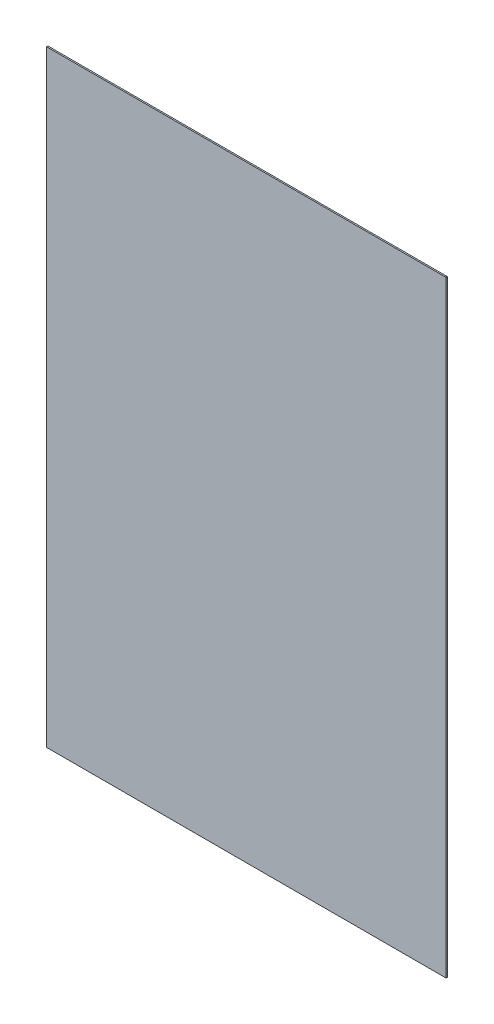
ISO-10303-21;
HEADER;
FILE_DESCRIPTION(('STEP AP214'),'2;1');
FILE_NAME('part.step','',(''),(''),'','','');
FILE_SCHEMA(('AUTOMOTIVE_DESIGN { 1 0 10303 214 1 1 1 1 }'));
ENDSEC;
DATA;
#1=APPLICATION_CONTEXT('core data for automotive mechanical design processes');
#2=APPLICATION_PROTOCOL_DEFINITION('international standard','automotive_design',2000,#1);
#3=PRODUCT_CONTEXT('',#1,'mechanical');
#4=PRODUCT('Part','Part','',(#3));
#5=PRODUCT_RELATED_PRODUCT_CATEGORY('part','',(#4));
#6=PRODUCT_DEFINITION_FORMATION('','',#4);
#7=PRODUCT_DEFINITION_CONTEXT('part definition',#1,'design');
#8=PRODUCT_DEFINITION('design','',#6,#7);
#9=PRODUCT_DEFINITION_SHAPE('','',#8);
#10=(LENGTH_UNIT() NAMED_UNIT(*) SI_UNIT(.MILLI.,.METRE.));
#11=(NAMED_UNIT(*) PLANE_ANGLE_UNIT() SI_UNIT($,.RADIAN.));
#12=(NAMED_UNIT(*) SI_UNIT($,.STERADIAN.) SOLID_ANGLE_UNIT());
#13=UNCERTAINTY_MEASURE_WITH_UNIT(LENGTH_MEASURE(1.E-05),#10,'distance_accuracy_value','');
#14=(GEOMETRIC_REPRESENTATION_CONTEXT(3) GLOBAL_UNCERTAINTY_ASSIGNED_CONTEXT((#13)) GLOBAL_UNIT_ASSIGNED_CONTEXT((#10,
#11,#12)) REPRESENTATION_CONTEXT('',''));
#15=CARTESIAN_POINT('',(0.,0.,0.));
#16=DIRECTION('',(0.,0.,1.));
#17=DIRECTION('',(1.,0.,0.));
#18=AXIS2_PLACEMENT_3D('',#15,#16,#17);
#19=CARTESIAN_POINT('',(0.,0.,0.00889));
#20=DIRECTION('',(0.,0.,1.));
#21=DIRECTION('',(1.,0.,0.));
#22=AXIS2_PLACEMENT_3D('',#19,#20,#21);
#23=PLANE('',#22);
#24=DIRECTION('',(0.,1.,0.));
#25=VECTOR('',#24,1.);
#26=CARTESIAN_POINT('',(1.4735048,1.9685,0.00889));
#27=LINE('',#26,#25);
#28=CARTESIAN_POINT('',(1.4735048,-1.9685,0.00889));
#29=VERTEX_POINT('',#28);
#30=CARTESIAN_POINT('',(1.4735048,1.9685,0.00889));
#31=VERTEX_POINT('',#30);
#32=EDGE_CURVE('E68',#29,#31,#27,.T.);
#33=ORIENTED_EDGE('',*,*,#32,.F.);
#34=DIRECTION('',(1.,0.,0.));
#35=VECTOR('',#34,1.);
#36=CARTESIAN_POINT('',(1.4735048,-1.9685,0.00889));
#37=LINE('',#36,#35);
#38=CARTESIAN_POINT('',(4.064508,-1.9685,0.00889));
#39=VERTEX_POINT('',#38);
#40=EDGE_CURVE('E20',#39,#29,#37,.F.);
#41=ORIENTED_EDGE('',*,*,#40,.F.);
#42=DIRECTION('',(0.,1.,0.));
#43=VECTOR('',#42,1.);
#44=CARTESIAN_POINT('',(4.064508,-1.9685,0.00889));
#45=LINE('',#44,#43);
#46=CARTESIAN_POINT('',(4.064508,1.9685,0.00889));
#47=VERTEX_POINT('',#46);
#48=EDGE_CURVE('E58',#47,#39,#45,.F.);
#49=ORIENTED_EDGE('',*,*,#48,.F.);
#50=DIRECTION('',(1.,0.,0.));
#51=VECTOR('',#50,1.);
#52=CARTESIAN_POINT('',(4.064508,1.9685,0.00889));
#53=LINE('',#52,#51);
#54=EDGE_CURVE('E53',#31,#47,#53,.T.);
#55=ORIENTED_EDGE('',*,*,#54,.F.);
#56=EDGE_LOOP('',(#33,#41,#49,#55));
#57=FACE_BOUND('',#56,.T.);
#58=ADVANCED_FACE('F17',(#57),#23,.T.);
#59=CARTESIAN_POINT('',(1.4735048,-1.9685,0.));
#60=DIRECTION('',(0.,-1.,0.));
#61=DIRECTION('',(0.,0.,-1.));
#62=AXIS2_PLACEMENT_3D('',#59,#60,#61);
#63=PLANE('',#62);
#64=DIRECTION('',(0.,0.,1.));
#65=VECTOR('',#64,1.);
#66=CARTESIAN_POINT('',(1.4735048,-1.9685,0.));
#67=LINE('',#66,#65);
#68=CARTESIAN_POINT('',(1.4735048,-1.9685,0.));
#69=VERTEX_POINT('',#68);
#70=EDGE_CURVE('E79',#69,#29,#67,.T.);
#71=ORIENTED_EDGE('',*,*,#70,.F.);
#72=DIRECTION('',(1.,0.,0.));
#73=VECTOR('',#72,1.);
#74=CARTESIAN_POINT('',(0.,-1.9685,0.));
#75=LINE('',#74,#73);
#76=CARTESIAN_POINT('',(4.064508,-1.9685,0.));
#77=VERTEX_POINT('',#76);
#78=EDGE_CURVE('E74',#69,#77,#75,.T.);
#79=ORIENTED_EDGE('',*,*,#78,.T.);
#80=DIRECTION('',(0.,0.,-1.));
#81=VECTOR('',#80,1.);
#82=CARTESIAN_POINT('',(4.064508,-1.9685,0.));
#83=LINE('',#82,#81);
#84=EDGE_CURVE('E63',#39,#77,#83,.T.);
#85=ORIENTED_EDGE('',*,*,#84,.F.);
#86=ORIENTED_EDGE('',*,*,#40,.T.);
#87=EDGE_LOOP('',(#71,#79,#85,#86));
#88=FACE_BOUND('',#87,.T.);
#89=ADVANCED_FACE('F73',(#88),#63,.T.);
#90=CARTESIAN_POINT('',(4.064508,-1.9685,0.));
#91=DIRECTION('',(1.,0.,0.));
#92=DIRECTION('',(0.,0.,-1.));
#93=AXIS2_PLACEMENT_3D('',#90,#91,#92);
#94=PLANE('',#93);
#95=ORIENTED_EDGE('',*,*,#84,.T.);
#96=DIRECTION('',(0.,1.,0.));
#97=VECTOR('',#96,1.);
#98=CARTESIAN_POINT('',(4.064508,0.,0.));
#99=LINE('',#98,#97);
#100=CARTESIAN_POINT('',(4.064508,1.9685,0.));
#101=VERTEX_POINT('',#100);
#102=EDGE_CURVE('E84',#77,#101,#99,.T.);
#103=ORIENTED_EDGE('',*,*,#102,.T.);
#104=DIRECTION('',(0.,0.,1.));
#105=VECTOR('',#104,1.);
#106=CARTESIAN_POINT('',(4.064508,1.9685,0.));
#107=LINE('',#106,#105);
#108=EDGE_CURVE('E65',#47,#101,#107,.F.);
#109=ORIENTED_EDGE('',*,*,#108,.F.);
#110=ORIENTED_EDGE('',*,*,#48,.T.);
#111=EDGE_LOOP('',(#95,#103,#109,#110));
#112=FACE_BOUND('',#111,.T.);
#113=ADVANCED_FACE('F60',(#112),#94,.T.);
#114=CARTESIAN_POINT('',(4.064508,1.9685,0.));
#115=DIRECTION('',(0.,1.,0.));
#116=DIRECTION('',(0.,0.,1.));
#117=AXIS2_PLACEMENT_3D('',#114,#115,#116);
#118=PLANE('',#117);
#119=ORIENTED_EDGE('',*,*,#108,.T.);
#120=DIRECTION('',(1.,0.,0.));
#121=VECTOR('',#120,1.);
#122=CARTESIAN_POINT('',(0.,1.9685,0.));
#123=LINE('',#122,#121);
#124=CARTESIAN_POINT('',(1.4735048,1.9685,0.));
#125=VERTEX_POINT('',#124);
#126=EDGE_CURVE('E26',#101,#125,#123,.F.);
#127=ORIENTED_EDGE('',*,*,#126,.T.);
#128=DIRECTION('',(0.,0.,1.));
#129=VECTOR('',#128,1.);
#130=CARTESIAN_POINT('',(1.4735048,1.9685,0.));
#131=LINE('',#130,#129);
#132=EDGE_CURVE('E34',#31,#125,#131,.F.);
#133=ORIENTED_EDGE('',*,*,#132,.F.);
#134=ORIENTED_EDGE('',*,*,#54,.T.);
#135=EDGE_LOOP('',(#119,#127,#133,#134));
#136=FACE_BOUND('',#135,.T.);
#137=ADVANCED_FACE('F88',(#136),#118,.T.);
#138=CARTESIAN_POINT('',(1.4735048,1.9685,0.));
#139=DIRECTION('',(-1.,0.,0.));
#140=DIRECTION('',(0.,0.,1.));
#141=AXIS2_PLACEMENT_3D('',#138,#139,#140);
#142=PLANE('',#141);
#143=ORIENTED_EDGE('',*,*,#132,.T.);
#144=DIRECTION('',(0.,1.,0.));
#145=VECTOR('',#144,1.);
#146=CARTESIAN_POINT('',(1.4735048,0.,0.));
#147=LINE('',#146,#145);
#148=EDGE_CURVE('E11',#125,#69,#147,.F.);
#149=ORIENTED_EDGE('',*,*,#148,.T.);
#150=ORIENTED_EDGE('',*,*,#70,.T.);
#151=ORIENTED_EDGE('',*,*,#32,.T.);
#152=EDGE_LOOP('',(#143,#149,#150,#151));
#153=FACE_BOUND('',#152,.T.);
#154=ADVANCED_FACE('F91',(#153),#142,.T.);
#155=CARTESIAN_POINT('',(0.,0.,0.));
#156=DIRECTION('',(0.,0.,1.));
#157=DIRECTION('',(1.,0.,0.));
#158=AXIS2_PLACEMENT_3D('',#155,#156,#157);
#159=PLANE('',#158);
#160=ORIENTED_EDGE('',*,*,#126,.F.);
#161=ORIENTED_EDGE('',*,*,#102,.F.);
#162=ORIENTED_EDGE('',*,*,#78,.F.);
#163=ORIENTED_EDGE('',*,*,#148,.F.);
#164=EDGE_LOOP('',(#160,#161,#162,#163));
#165=FACE_BOUND('',#164,.T.);
#166=ADVANCED_FACE('F90',(#165),#159,.F.);
#167=CLOSED_SHELL('',(#58,#89,#113,#137,#154,#166));
#168=MANIFOLD_SOLID_BREP('B1',#167);
#169=ADVANCED_BREP_SHAPE_REPRESENTATION('',(#18,#168),#14);
#170=SHAPE_DEFINITION_REPRESENTATION(#9,#169);
ENDSEC;
END-ISO-10303-21;
